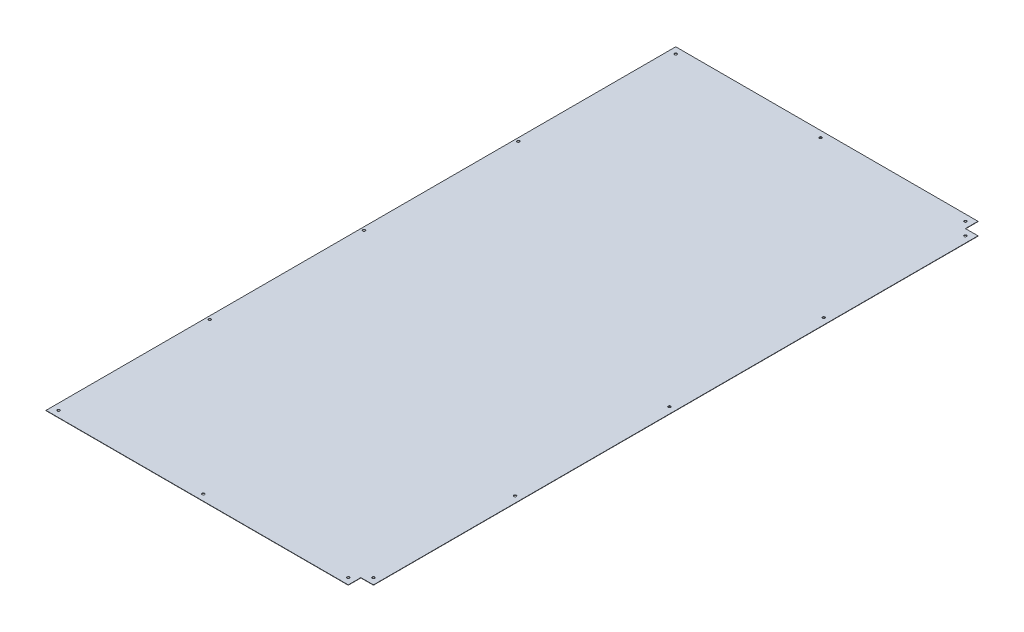
ISO-10303-21;
HEADER;
FILE_DESCRIPTION(('STEP AP214'),'2;1');
FILE_NAME('part.step','',(''),(''),'','','');
FILE_SCHEMA(('AUTOMOTIVE_DESIGN { 1 0 10303 214 1 1 1 1 }'));
ENDSEC;
DATA;
#1=APPLICATION_CONTEXT('core data for automotive mechanical design processes');
#2=APPLICATION_PROTOCOL_DEFINITION('international standard','automotive_design',2000,#1);
#3=PRODUCT_CONTEXT('',#1,'mechanical');
#4=PRODUCT('Part','Part','',(#3));
#5=PRODUCT_RELATED_PRODUCT_CATEGORY('part','',(#4));
#6=PRODUCT_DEFINITION_FORMATION('','',#4);
#7=PRODUCT_DEFINITION_CONTEXT('part definition',#1,'design');
#8=PRODUCT_DEFINITION('design','',#6,#7);
#9=PRODUCT_DEFINITION_SHAPE('','',#8);
#10=(LENGTH_UNIT() NAMED_UNIT(*) SI_UNIT(.MILLI.,.METRE.));
#11=(NAMED_UNIT(*) PLANE_ANGLE_UNIT() SI_UNIT($,.RADIAN.));
#12=(NAMED_UNIT(*) SI_UNIT($,.STERADIAN.) SOLID_ANGLE_UNIT());
#13=UNCERTAINTY_MEASURE_WITH_UNIT(LENGTH_MEASURE(1.E-05),#10,'distance_accuracy_value','');
#14=(GEOMETRIC_REPRESENTATION_CONTEXT(3) GLOBAL_UNCERTAINTY_ASSIGNED_CONTEXT((#13)) GLOBAL_UNIT_ASSIGNED_CONTEXT((#10,
#11,#12)) REPRESENTATION_CONTEXT('',''));
#15=CARTESIAN_POINT('',(0.,0.,0.));
#16=DIRECTION('',(0.,0.,1.));
#17=DIRECTION('',(1.,0.,0.));
#18=AXIS2_PLACEMENT_3D('',#15,#16,#17);
#19=CARTESIAN_POINT('',(2.66453525910037E-12,1.,960.000000000001));
#20=DIRECTION('',(0.,0.,1.));
#21=DIRECTION('',(1.,0.,0.));
#22=AXIS2_PLACEMENT_3D('',#19,#20,#21);
#23=PLANE('',#22);
#24=DIRECTION('',(-1.,0.,0.));
#25=VECTOR('',#24,1.);
#26=CARTESIAN_POINT('',(2.66453525910037E-12,0.,960.000000000001));
#27=LINE('',#26,#25);
#28=CARTESIAN_POINT('',(500.,0.,960.));
#29=VERTEX_POINT('',#28);
#30=CARTESIAN_POINT('',(460.,0.,960.));
#31=VERTEX_POINT('',#30);
#32=EDGE_CURVE('E239',#29,#31,#27,.T.);
#33=ORIENTED_EDGE('',*,*,#32,.F.);
#34=DIRECTION('',(0.,-1.,0.));
#35=VECTOR('',#34,1.);
#36=CARTESIAN_POINT('',(500.,1.,960.));
#37=LINE('',#36,#35);
#38=CARTESIAN_POINT('',(500.,1.,960.));
#39=VERTEX_POINT('',#38);
#40=EDGE_CURVE('E98',#39,#29,#37,.T.);
#41=ORIENTED_EDGE('',*,*,#40,.F.);
#42=DIRECTION('',(-1.,0.,0.));
#43=VECTOR('',#42,1.);
#44=CARTESIAN_POINT('',(2.66453525910037E-12,1.,960.000000000001));
#45=LINE('',#44,#43);
#46=CARTESIAN_POINT('',(460.,1.,960.));
#47=VERTEX_POINT('',#46);
#48=EDGE_CURVE('E268',#39,#47,#45,.T.);
#49=ORIENTED_EDGE('',*,*,#48,.T.);
#50=DIRECTION('',(0.,-1.,0.));
#51=VECTOR('',#50,1.);
#52=CARTESIAN_POINT('',(460.,1.,960.));
#53=LINE('',#52,#51);
#54=EDGE_CURVE('E94',#47,#31,#53,.T.);
#55=ORIENTED_EDGE('',*,*,#54,.T.);
#56=EDGE_LOOP('',(#33,#41,#49,#55));
#57=FACE_BOUND('',#56,.T.);
#58=ADVANCED_FACE('F41',(#57),#23,.T.);
#59=CARTESIAN_POINT('',(500.,1.,0.));
#60=DIRECTION('',(-1.,0.,0.));
#61=DIRECTION('',(0.,0.,1.));
#62=AXIS2_PLACEMENT_3D('',#59,#60,#61);
#63=PLANE('',#62);
#64=DIRECTION('',(0.,0.,-1.));
#65=VECTOR('',#64,1.);
#66=CARTESIAN_POINT('',(500.,0.,0.));
#67=LINE('',#66,#65);
#68=CARTESIAN_POINT('',(500.,0.,-960.));
#69=VERTEX_POINT('',#68);
#70=EDGE_CURVE('E242',#29,#69,#67,.T.);
#71=ORIENTED_EDGE('',*,*,#70,.T.);
#72=DIRECTION('',(0.,-1.,0.));
#73=VECTOR('',#72,1.);
#74=CARTESIAN_POINT('',(500.,1.,-960.));
#75=LINE('',#74,#73);
#76=CARTESIAN_POINT('',(500.,1.,-960.));
#77=VERTEX_POINT('',#76);
#78=EDGE_CURVE('E153',#77,#69,#75,.T.);
#79=ORIENTED_EDGE('',*,*,#78,.F.);
#80=DIRECTION('',(0.,0.,-1.));
#81=VECTOR('',#80,1.);
#82=CARTESIAN_POINT('',(500.,1.,0.));
#83=LINE('',#82,#81);
#84=EDGE_CURVE('E436',#39,#77,#83,.T.);
#85=ORIENTED_EDGE('',*,*,#84,.F.);
#86=ORIENTED_EDGE('',*,*,#40,.T.);
#87=EDGE_LOOP('',(#71,#79,#85,#86));
#88=FACE_BOUND('',#87,.T.);
#89=ADVANCED_FACE('F329',(#88),#63,.F.);
#90=CARTESIAN_POINT('',(-2.66453525910039E-12,1.,-959.999999999998));
#91=DIRECTION('',(0.,0.,1.));
#92=DIRECTION('',(1.,0.,0.));
#93=AXIS2_PLACEMENT_3D('',#90,#91,#92);
#94=PLANE('',#93);
#95=DIRECTION('',(-1.,0.,0.));
#96=VECTOR('',#95,1.);
#97=CARTESIAN_POINT('',(-2.66453525910039E-12,0.,-959.999999999998));
#98=LINE('',#97,#96);
#99=CARTESIAN_POINT('',(460.,0.,-960.));
#100=VERTEX_POINT('',#99);
#101=EDGE_CURVE('E246',#69,#100,#98,.T.);
#102=ORIENTED_EDGE('',*,*,#101,.T.);
#103=DIRECTION('',(0.,-1.,0.));
#104=VECTOR('',#103,1.);
#105=CARTESIAN_POINT('',(460.,1.,-960.));
#106=LINE('',#105,#104);
#107=CARTESIAN_POINT('',(460.,1.,-960.));
#108=VERTEX_POINT('',#107);
#109=EDGE_CURVE('E150',#108,#100,#106,.T.);
#110=ORIENTED_EDGE('',*,*,#109,.F.);
#111=DIRECTION('',(-1.,0.,0.));
#112=VECTOR('',#111,1.);
#113=CARTESIAN_POINT('',(-2.66453525910039E-12,1.,-959.999999999998));
#114=LINE('',#113,#112);
#115=EDGE_CURVE('E438',#77,#108,#114,.T.);
#116=ORIENTED_EDGE('',*,*,#115,.F.);
#117=ORIENTED_EDGE('',*,*,#78,.T.);
#118=EDGE_LOOP('',(#102,#110,#116,#117));
#119=FACE_BOUND('',#118,.T.);
#120=ADVANCED_FACE('F334',(#119),#94,.F.);
#121=CARTESIAN_POINT('',(460.,1.,0.));
#122=DIRECTION('',(1.,0.,0.));
#123=DIRECTION('',(0.,0.,-1.));
#124=AXIS2_PLACEMENT_3D('',#121,#122,#123);
#125=PLANE('',#124);
#126=DIRECTION('',(0.,0.,1.));
#127=VECTOR('',#126,1.);
#128=CARTESIAN_POINT('',(460.,0.,0.));
#129=LINE('',#128,#127);
#130=CARTESIAN_POINT('',(460.,0.,-1000.));
#131=VERTEX_POINT('',#130);
#132=EDGE_CURVE('E250',#131,#100,#129,.T.);
#133=ORIENTED_EDGE('',*,*,#132,.F.);
#134=DIRECTION('',(0.,-1.,0.));
#135=VECTOR('',#134,1.);
#136=CARTESIAN_POINT('',(460.,1.,-1000.));
#137=LINE('',#136,#135);
#138=CARTESIAN_POINT('',(460.,1.,-1000.));
#139=VERTEX_POINT('',#138);
#140=EDGE_CURVE('E143',#139,#131,#137,.T.);
#141=ORIENTED_EDGE('',*,*,#140,.F.);
#142=DIRECTION('',(0.,0.,1.));
#143=VECTOR('',#142,1.);
#144=CARTESIAN_POINT('',(460.,1.,0.));
#145=LINE('',#144,#143);
#146=EDGE_CURVE('E445',#139,#108,#145,.T.);
#147=ORIENTED_EDGE('',*,*,#146,.T.);
#148=ORIENTED_EDGE('',*,*,#109,.T.);
#149=EDGE_LOOP('',(#133,#141,#147,#148));
#150=FACE_BOUND('',#149,.T.);
#151=ADVANCED_FACE('F455',(#150),#125,.T.);
#152=CARTESIAN_POINT('',(0.,1.,-1000.));
#153=DIRECTION('',(0.,0.,-1.));
#154=DIRECTION('',(-1.,0.,0.));
#155=AXIS2_PLACEMENT_3D('',#152,#153,#154);
#156=PLANE('',#155);
#157=DIRECTION('',(1.,0.,0.));
#158=VECTOR('',#157,1.);
#159=CARTESIAN_POINT('',(0.,0.,-1000.));
#160=LINE('',#159,#158);
#161=CARTESIAN_POINT('',(-500.,0.,-1000.));
#162=VERTEX_POINT('',#161);
#163=EDGE_CURVE('E254',#162,#131,#160,.T.);
#164=ORIENTED_EDGE('',*,*,#163,.F.);
#165=DIRECTION('',(0.,-1.,0.));
#166=VECTOR('',#165,1.);
#167=CARTESIAN_POINT('',(-500.,1.,-1000.));
#168=LINE('',#167,#166);
#169=CARTESIAN_POINT('',(-500.,1.,-1000.));
#170=VERTEX_POINT('',#169);
#171=EDGE_CURVE('E139',#170,#162,#168,.T.);
#172=ORIENTED_EDGE('',*,*,#171,.F.);
#173=DIRECTION('',(1.,0.,0.));
#174=VECTOR('',#173,1.);
#175=CARTESIAN_POINT('',(0.,1.,-1000.));
#176=LINE('',#175,#174);
#177=EDGE_CURVE('E131',#170,#139,#176,.T.);
#178=ORIENTED_EDGE('',*,*,#177,.T.);
#179=ORIENTED_EDGE('',*,*,#140,.T.);
#180=EDGE_LOOP('',(#164,#172,#178,#179));
#181=FACE_BOUND('',#180,.T.);
#182=ADVANCED_FACE('F452',(#181),#156,.T.);
#183=CARTESIAN_POINT('',(-500.,1.,0.));
#184=DIRECTION('',(1.,0.,0.));
#185=DIRECTION('',(0.,0.,-1.));
#186=AXIS2_PLACEMENT_3D('',#183,#184,#185);
#187=PLANE('',#186);
#188=DIRECTION('',(0.,0.,1.));
#189=VECTOR('',#188,1.);
#190=CARTESIAN_POINT('',(-500.,0.,0.));
#191=LINE('',#190,#189);
#192=CARTESIAN_POINT('',(-500.,0.,1000.));
#193=VERTEX_POINT('',#192);
#194=EDGE_CURVE('E137',#162,#193,#191,.T.);
#195=ORIENTED_EDGE('',*,*,#194,.T.);
#196=DIRECTION('',(0.,-1.,0.));
#197=VECTOR('',#196,1.);
#198=CARTESIAN_POINT('',(-500.,1.,1000.));
#199=LINE('',#198,#197);
#200=CARTESIAN_POINT('',(-500.,1.,1000.));
#201=VERTEX_POINT('',#200);
#202=EDGE_CURVE('E120',#201,#193,#199,.T.);
#203=ORIENTED_EDGE('',*,*,#202,.F.);
#204=DIRECTION('',(0.,0.,1.));
#205=VECTOR('',#204,1.);
#206=CARTESIAN_POINT('',(-500.,1.,0.));
#207=LINE('',#206,#205);
#208=EDGE_CURVE('E124',#170,#201,#207,.T.);
#209=ORIENTED_EDGE('',*,*,#208,.F.);
#210=ORIENTED_EDGE('',*,*,#171,.T.);
#211=EDGE_LOOP('',(#195,#203,#209,#210));
#212=FACE_BOUND('',#211,.T.);
#213=ADVANCED_FACE('F135',(#212),#187,.F.);
#214=CARTESIAN_POINT('',(0.,1.,1000.));
#215=DIRECTION('',(0.,0.,-1.));
#216=DIRECTION('',(-1.,0.,0.));
#217=AXIS2_PLACEMENT_3D('',#214,#215,#216);
#218=PLANE('',#217);
#219=DIRECTION('',(1.,0.,0.));
#220=VECTOR('',#219,1.);
#221=CARTESIAN_POINT('',(0.,0.,1000.));
#222=LINE('',#221,#220);
#223=CARTESIAN_POINT('',(460.,0.,1000.));
#224=VERTEX_POINT('',#223);
#225=EDGE_CURVE('E260',#193,#224,#222,.T.);
#226=ORIENTED_EDGE('',*,*,#225,.T.);
#227=DIRECTION('',(0.,-1.,0.));
#228=VECTOR('',#227,1.);
#229=CARTESIAN_POINT('',(460.,1.,1000.));
#230=LINE('',#229,#228);
#231=CARTESIAN_POINT('',(460.,1.,1000.));
#232=VERTEX_POINT('',#231);
#233=EDGE_CURVE('E122',#232,#224,#230,.T.);
#234=ORIENTED_EDGE('',*,*,#233,.F.);
#235=DIRECTION('',(1.,0.,0.));
#236=VECTOR('',#235,1.);
#237=CARTESIAN_POINT('',(0.,1.,1000.));
#238=LINE('',#237,#236);
#239=EDGE_CURVE('E115',#201,#232,#238,.T.);
#240=ORIENTED_EDGE('',*,*,#239,.F.);
#241=ORIENTED_EDGE('',*,*,#202,.T.);
#242=EDGE_LOOP('',(#226,#234,#240,#241));
#243=FACE_BOUND('',#242,.T.);
#244=ADVANCED_FACE('F118',(#243),#218,.F.);
#245=CARTESIAN_POINT('',(460.000000000001,1.,6.3837823915947E-13));
#246=DIRECTION('',(-1.,0.,0.));
#247=DIRECTION('',(0.,0.,1.));
#248=AXIS2_PLACEMENT_3D('',#245,#246,#247);
#249=PLANE('',#248);
#250=DIRECTION('',(0.,0.,-1.));
#251=VECTOR('',#250,1.);
#252=CARTESIAN_POINT('',(460.000000000001,0.,6.3837823915947E-13));
#253=LINE('',#252,#251);
#254=EDGE_CURVE('E87',#224,#31,#253,.T.);
#255=ORIENTED_EDGE('',*,*,#254,.T.);
#256=ORIENTED_EDGE('',*,*,#54,.F.);
#257=DIRECTION('',(0.,0.,-1.));
#258=VECTOR('',#257,1.);
#259=CARTESIAN_POINT('',(460.000000000001,1.,6.3837823915947E-13));
#260=LINE('',#259,#258);
#261=EDGE_CURVE('E59',#232,#47,#260,.T.);
#262=ORIENTED_EDGE('',*,*,#261,.F.);
#263=ORIENTED_EDGE('',*,*,#233,.T.);
#264=EDGE_LOOP('',(#255,#256,#262,#263));
#265=FACE_BOUND('',#264,.T.);
#266=ADVANCED_FACE('F410',(#265),#249,.F.);
#267=CARTESIAN_POINT('',(0.,1.,0.));
#268=DIRECTION('',(0.,1.,0.));
#269=DIRECTION('',(0.,0.,1.));
#270=AXIS2_PLACEMENT_3D('',#267,#268,#269);
#271=PLANE('',#270);
#272=CARTESIAN_POINT('',(-480.,1.,980.));
#273=DIRECTION('',(0.,1.,0.));
#274=DIRECTION('',(0.,0.,1.));
#275=AXIS2_PLACEMENT_3D('',#272,#273,#274);
#276=CIRCLE('',#275,4.00000000000023);
#277=CARTESIAN_POINT('',(-480.,1.,984.));
#278=VERTEX_POINT('',#277);
#279=EDGE_CURVE('E11',#278,#278,#276,.F.);
#280=ORIENTED_EDGE('',*,*,#279,.T.);
#281=EDGE_LOOP('',(#280));
#282=FACE_BOUND('',#281,.T.);
#283=CARTESIAN_POINT('',(480.,1.,940.));
#284=DIRECTION('',(0.,1.,0.));
#285=DIRECTION('',(0.,0.,1.));
#286=AXIS2_PLACEMENT_3D('',#283,#284,#285);
#287=CIRCLE('',#286,4.00000000000023);
#288=CARTESIAN_POINT('',(480.,1.,944.));
#289=VERTEX_POINT('',#288);
#290=EDGE_CURVE('E51',#289,#289,#287,.F.);
#291=ORIENTED_EDGE('',*,*,#290,.T.);
#292=EDGE_LOOP('',(#291));
#293=FACE_BOUND('',#292,.T.);
#294=CARTESIAN_POINT('',(440.,1.,980.));
#295=DIRECTION('',(0.,1.,0.));
#296=DIRECTION('',(0.,0.,1.));
#297=AXIS2_PLACEMENT_3D('',#294,#295,#296);
#298=CIRCLE('',#297,4.00000000000023);
#299=CARTESIAN_POINT('',(440.,1.,984.));
#300=VERTEX_POINT('',#299);
#301=EDGE_CURVE('E203',#300,#300,#298,.F.);
#302=ORIENTED_EDGE('',*,*,#301,.T.);
#303=EDGE_LOOP('',(#302));
#304=FACE_BOUND('',#303,.T.);
#305=CARTESIAN_POINT('',(-20.0000000000002,1.,980.));
#306=DIRECTION('',(0.,1.,0.));
#307=DIRECTION('',(0.,0.,1.));
#308=AXIS2_PLACEMENT_3D('',#305,#306,#307);
#309=CIRCLE('',#308,4.00000000000023);
#310=CARTESIAN_POINT('',(-20.0000000000002,1.,984.));
#311=VERTEX_POINT('',#310);
#312=EDGE_CURVE('E199',#311,#311,#309,.F.);
#313=ORIENTED_EDGE('',*,*,#312,.T.);
#314=EDGE_LOOP('',(#313));
#315=FACE_BOUND('',#314,.T.);
#316=CARTESIAN_POINT('',(-490.,1.,490.));
#317=DIRECTION('',(0.,1.,0.));
#318=DIRECTION('',(0.,0.,1.));
#319=AXIS2_PLACEMENT_3D('',#316,#317,#318);
#320=CIRCLE('',#319,4.00000000000089);
#321=CARTESIAN_POINT('',(-490.,1.,494.000000000001));
#322=VERTEX_POINT('',#321);
#323=EDGE_CURVE('E195',#322,#322,#320,.F.);
#324=ORIENTED_EDGE('',*,*,#323,.T.);
#325=EDGE_LOOP('',(#324));
#326=FACE_BOUND('',#325,.T.);
#327=CARTESIAN_POINT('',(-490.,1.,0.));
#328=DIRECTION('',(0.,1.,0.));
#329=DIRECTION('',(0.,0.,1.));
#330=AXIS2_PLACEMENT_3D('',#327,#328,#329);
#331=CIRCLE('',#330,4.00000000000023);
#332=CARTESIAN_POINT('',(-490.,1.,4.00000000000022));
#333=VERTEX_POINT('',#332);
#334=EDGE_CURVE('E191',#333,#333,#331,.F.);
#335=ORIENTED_EDGE('',*,*,#334,.T.);
#336=EDGE_LOOP('',(#335));
#337=FACE_BOUND('',#336,.T.);
#338=CARTESIAN_POINT('',(-490.000000000002,1.,-490.));
#339=DIRECTION('',(0.,1.,0.));
#340=DIRECTION('',(0.,0.,1.));
#341=AXIS2_PLACEMENT_3D('',#338,#339,#340);
#342=CIRCLE('',#341,4.00000000000023);
#343=CARTESIAN_POINT('',(-490.000000000002,1.,-486.));
#344=VERTEX_POINT('',#343);
#345=EDGE_CURVE('E187',#344,#344,#342,.F.);
#346=ORIENTED_EDGE('',*,*,#345,.T.);
#347=EDGE_LOOP('',(#346));
#348=FACE_BOUND('',#347,.T.);
#349=CARTESIAN_POINT('',(-480.,1.,-980.));
#350=DIRECTION('',(0.,1.,0.));
#351=DIRECTION('',(0.,0.,1.));
#352=AXIS2_PLACEMENT_3D('',#349,#350,#351);
#353=CIRCLE('',#352,4.00000000000023);
#354=CARTESIAN_POINT('',(-480.,1.,-976.));
#355=VERTEX_POINT('',#354);
#356=EDGE_CURVE('E183',#355,#355,#353,.F.);
#357=ORIENTED_EDGE('',*,*,#356,.T.);
#358=EDGE_LOOP('',(#357));
#359=FACE_BOUND('',#358,.T.);
#360=CARTESIAN_POINT('',(-20.0000000000002,1.,-980.));
#361=DIRECTION('',(0.,1.,0.));
#362=DIRECTION('',(0.,0.,1.));
#363=AXIS2_PLACEMENT_3D('',#360,#361,#362);
#364=CIRCLE('',#363,4.00000000000023);
#365=CARTESIAN_POINT('',(-20.0000000000002,1.,-976.));
#366=VERTEX_POINT('',#365);
#367=EDGE_CURVE('E179',#366,#366,#364,.F.);
#368=ORIENTED_EDGE('',*,*,#367,.T.);
#369=EDGE_LOOP('',(#368));
#370=FACE_BOUND('',#369,.T.);
#371=CARTESIAN_POINT('',(440.,1.,-980.));
#372=DIRECTION('',(0.,1.,0.));
#373=DIRECTION('',(0.,0.,1.));
#374=AXIS2_PLACEMENT_3D('',#371,#372,#373);
#375=CIRCLE('',#374,4.00000000000023);
#376=CARTESIAN_POINT('',(440.,1.,-976.));
#377=VERTEX_POINT('',#376);
#378=EDGE_CURVE('E175',#377,#377,#375,.F.);
#379=ORIENTED_EDGE('',*,*,#378,.T.);
#380=EDGE_LOOP('',(#379));
#381=FACE_BOUND('',#380,.T.);
#382=CARTESIAN_POINT('',(480.,1.,-940.));
#383=DIRECTION('',(0.,1.,0.));
#384=DIRECTION('',(0.,0.,1.));
#385=AXIS2_PLACEMENT_3D('',#382,#383,#384);
#386=CIRCLE('',#385,4.00000000000023);
#387=CARTESIAN_POINT('',(480.,1.,-936.));
#388=VERTEX_POINT('',#387);
#389=EDGE_CURVE('E171',#388,#388,#386,.F.);
#390=ORIENTED_EDGE('',*,*,#389,.T.);
#391=EDGE_LOOP('',(#390));
#392=FACE_BOUND('',#391,.T.);
#393=CARTESIAN_POINT('',(480.,1.,-490.));
#394=DIRECTION('',(0.,1.,0.));
#395=DIRECTION('',(0.,0.,1.));
#396=AXIS2_PLACEMENT_3D('',#393,#394,#395);
#397=CIRCLE('',#396,4.00000000000023);
#398=CARTESIAN_POINT('',(480.,1.,-486.));
#399=VERTEX_POINT('',#398);
#400=EDGE_CURVE('E167',#399,#399,#397,.F.);
#401=ORIENTED_EDGE('',*,*,#400,.T.);
#402=EDGE_LOOP('',(#401));
#403=FACE_BOUND('',#402,.T.);
#404=CARTESIAN_POINT('',(480.,1.,-1.11022302462516E-13));
#405=DIRECTION('',(0.,1.,0.));
#406=DIRECTION('',(0.,0.,1.));
#407=AXIS2_PLACEMENT_3D('',#404,#405,#406);
#408=CIRCLE('',#407,4.00000000000023);
#409=CARTESIAN_POINT('',(480.,1.,4.00000000000011));
#410=VERTEX_POINT('',#409);
#411=EDGE_CURVE('E163',#410,#410,#408,.F.);
#412=ORIENTED_EDGE('',*,*,#411,.T.);
#413=EDGE_LOOP('',(#412));
#414=FACE_BOUND('',#413,.T.);
#415=CARTESIAN_POINT('',(480.,1.,490.));
#416=DIRECTION('',(0.,1.,0.));
#417=DIRECTION('',(0.,0.,1.));
#418=AXIS2_PLACEMENT_3D('',#415,#416,#417);
#419=CIRCLE('',#418,4.00000000000089);
#420=CARTESIAN_POINT('',(480.,1.,494.000000000001));
#421=VERTEX_POINT('',#420);
#422=EDGE_CURVE('E159',#421,#421,#419,.F.);
#423=ORIENTED_EDGE('',*,*,#422,.T.);
#424=EDGE_LOOP('',(#423));
#425=FACE_BOUND('',#424,.T.);
#426=ORIENTED_EDGE('',*,*,#48,.F.);
#427=ORIENTED_EDGE('',*,*,#84,.T.);
#428=ORIENTED_EDGE('',*,*,#115,.T.);
#429=ORIENTED_EDGE('',*,*,#146,.F.);
#430=ORIENTED_EDGE('',*,*,#177,.F.);
#431=ORIENTED_EDGE('',*,*,#208,.T.);
#432=ORIENTED_EDGE('',*,*,#239,.T.);
#433=ORIENTED_EDGE('',*,*,#261,.T.);
#434=EDGE_LOOP('',(#426,#427,#428,#429,#430,#431,#432,#433));
#435=FACE_BOUND('',#434,.T.);
#436=ADVANCED_FACE('F128',(#282,#293,#304,#315,#326,#337,#348,#359,#370,#381,#392,#403,#414,
#425,#435),#271,.T.);
#437=CARTESIAN_POINT('',(0.,0.,0.));
#438=DIRECTION('',(0.,1.,0.));
#439=DIRECTION('',(0.,0.,1.));
#440=AXIS2_PLACEMENT_3D('',#437,#438,#439);
#441=PLANE('',#440);
#442=CARTESIAN_POINT('',(480.,0.,-1.11022302462516E-13));
#443=DIRECTION('',(0.,1.,0.));
#444=DIRECTION('',(0.,0.,1.));
#445=AXIS2_PLACEMENT_3D('',#442,#443,#444);
#446=CIRCLE('',#445,2.99999999999999);
#447=CARTESIAN_POINT('',(480.,0.,2.99999999999988));
#448=VERTEX_POINT('',#447);
#449=EDGE_CURVE('E273',#448,#448,#446,.T.);
#450=ORIENTED_EDGE('',*,*,#449,.T.);
#451=EDGE_LOOP('',(#450));
#452=FACE_BOUND('',#451,.T.);
#453=CARTESIAN_POINT('',(-490.,0.,490.));
#454=DIRECTION('',(0.,1.,0.));
#455=DIRECTION('',(0.,0.,1.));
#456=AXIS2_PLACEMENT_3D('',#453,#454,#455);
#457=CIRCLE('',#456,2.99999999999999);
#458=CARTESIAN_POINT('',(-490.,0.,493.));
#459=VERTEX_POINT('',#458);
#460=EDGE_CURVE('E277',#459,#459,#457,.F.);
#461=ORIENTED_EDGE('',*,*,#460,.F.);
#462=EDGE_LOOP('',(#461));
#463=FACE_BOUND('',#462,.T.);
#464=CARTESIAN_POINT('',(-490.000000000002,0.,-490.));
#465=DIRECTION('',(0.,1.,0.));
#466=DIRECTION('',(0.,0.,1.));
#467=AXIS2_PLACEMENT_3D('',#464,#465,#466);
#468=CIRCLE('',#467,2.99999999999999);
#469=CARTESIAN_POINT('',(-490.000000000002,0.,-487.));
#470=VERTEX_POINT('',#469);
#471=EDGE_CURVE('E281',#470,#470,#468,.T.);
#472=ORIENTED_EDGE('',*,*,#471,.T.);
#473=EDGE_LOOP('',(#472));
#474=FACE_BOUND('',#473,.T.);
#475=CARTESIAN_POINT('',(-480.,0.,-980.));
#476=DIRECTION('',(0.,1.,0.));
#477=DIRECTION('',(0.,0.,1.));
#478=AXIS2_PLACEMENT_3D('',#475,#476,#477);
#479=CIRCLE('',#478,2.99999999999999);
#480=CARTESIAN_POINT('',(-480.,0.,-977.));
#481=VERTEX_POINT('',#480);
#482=EDGE_CURVE('E285',#481,#481,#479,.T.);
#483=ORIENTED_EDGE('',*,*,#482,.T.);
#484=EDGE_LOOP('',(#483));
#485=FACE_BOUND('',#484,.T.);
#486=CARTESIAN_POINT('',(-480.,0.,980.));
#487=DIRECTION('',(0.,1.,0.));
#488=DIRECTION('',(0.,0.,1.));
#489=AXIS2_PLACEMENT_3D('',#486,#487,#488);
#490=CIRCLE('',#489,2.99999999999999);
#491=CARTESIAN_POINT('',(-480.,0.,983.));
#492=VERTEX_POINT('',#491);
#493=EDGE_CURVE('E289',#492,#492,#490,.T.);
#494=ORIENTED_EDGE('',*,*,#493,.T.);
#495=EDGE_LOOP('',(#494));
#496=FACE_BOUND('',#495,.T.);
#497=CARTESIAN_POINT('',(480.,0.,-490.));
#498=DIRECTION('',(0.,1.,0.));
#499=DIRECTION('',(0.,0.,1.));
#500=AXIS2_PLACEMENT_3D('',#497,#498,#499);
#501=CIRCLE('',#500,2.99999999999999);
#502=CARTESIAN_POINT('',(480.,0.,-487.));
#503=VERTEX_POINT('',#502);
#504=EDGE_CURVE('E293',#503,#503,#501,.T.);
#505=ORIENTED_EDGE('',*,*,#504,.T.);
#506=EDGE_LOOP('',(#505));
#507=FACE_BOUND('',#506,.T.);
#508=CARTESIAN_POINT('',(-20.0000000000002,0.,980.));
#509=DIRECTION('',(0.,1.,0.));
#510=DIRECTION('',(0.,0.,1.));
#511=AXIS2_PLACEMENT_3D('',#508,#509,#510);
#512=CIRCLE('',#511,3.);
#513=CARTESIAN_POINT('',(-20.0000000000002,0.,983.));
#514=VERTEX_POINT('',#513);
#515=EDGE_CURVE('E297',#514,#514,#512,.T.);
#516=ORIENTED_EDGE('',*,*,#515,.T.);
#517=EDGE_LOOP('',(#516));
#518=FACE_BOUND('',#517,.T.);
#519=CARTESIAN_POINT('',(-20.0000000000002,0.,-980.));
#520=DIRECTION('',(0.,1.,0.));
#521=DIRECTION('',(0.,0.,1.));
#522=AXIS2_PLACEMENT_3D('',#519,#520,#521);
#523=CIRCLE('',#522,3.);
#524=CARTESIAN_POINT('',(-20.0000000000002,0.,-977.));
#525=VERTEX_POINT('',#524);
#526=EDGE_CURVE('E301',#525,#525,#523,.T.);
#527=ORIENTED_EDGE('',*,*,#526,.T.);
#528=EDGE_LOOP('',(#527));
#529=FACE_BOUND('',#528,.T.);
#530=CARTESIAN_POINT('',(-490.,0.,0.));
#531=DIRECTION('',(0.,1.,0.));
#532=DIRECTION('',(0.,0.,1.));
#533=AXIS2_PLACEMENT_3D('',#530,#531,#532);
#534=CIRCLE('',#533,2.99999999999999);
#535=CARTESIAN_POINT('',(-490.,0.,2.99999999999999));
#536=VERTEX_POINT('',#535);
#537=EDGE_CURVE('E232',#536,#536,#534,.T.);
#538=ORIENTED_EDGE('',*,*,#537,.T.);
#539=EDGE_LOOP('',(#538));
#540=FACE_BOUND('',#539,.T.);
#541=CARTESIAN_POINT('',(440.,0.,980.));
#542=DIRECTION('',(0.,1.,0.));
#543=DIRECTION('',(0.,0.,1.));
#544=AXIS2_PLACEMENT_3D('',#541,#542,#543);
#545=CIRCLE('',#544,2.99999999999999);
#546=CARTESIAN_POINT('',(440.,0.,983.));
#547=VERTEX_POINT('',#546);
#548=EDGE_CURVE('E224',#547,#547,#545,.T.);
#549=ORIENTED_EDGE('',*,*,#548,.T.);
#550=EDGE_LOOP('',(#549));
#551=FACE_BOUND('',#550,.T.);
#552=CARTESIAN_POINT('',(480.,0.,940.));
#553=DIRECTION('',(0.,1.,0.));
#554=DIRECTION('',(0.,0.,1.));
#555=AXIS2_PLACEMENT_3D('',#552,#553,#554);
#556=CIRCLE('',#555,2.99999999999999);
#557=CARTESIAN_POINT('',(480.,0.,943.));
#558=VERTEX_POINT('',#557);
#559=EDGE_CURVE('E220',#558,#558,#556,.T.);
#560=ORIENTED_EDGE('',*,*,#559,.T.);
#561=EDGE_LOOP('',(#560));
#562=FACE_BOUND('',#561,.T.);
#563=CARTESIAN_POINT('',(440.,0.,-980.));
#564=DIRECTION('',(0.,1.,0.));
#565=DIRECTION('',(0.,0.,1.));
#566=AXIS2_PLACEMENT_3D('',#563,#564,#565);
#567=CIRCLE('',#566,2.99999999999999);
#568=CARTESIAN_POINT('',(440.,0.,-977.));
#569=VERTEX_POINT('',#568);
#570=EDGE_CURVE('E223',#569,#569,#567,.T.);
#571=ORIENTED_EDGE('',*,*,#570,.T.);
#572=EDGE_LOOP('',(#571));
#573=FACE_BOUND('',#572,.T.);
#574=CARTESIAN_POINT('',(480.,0.,-940.));
#575=DIRECTION('',(0.,1.,0.));
#576=DIRECTION('',(0.,0.,1.));
#577=AXIS2_PLACEMENT_3D('',#574,#575,#576);
#578=CIRCLE('',#577,2.99999999999999);
#579=CARTESIAN_POINT('',(480.,0.,-937.));
#580=VERTEX_POINT('',#579);
#581=EDGE_CURVE('E229',#580,#580,#578,.T.);
#582=ORIENTED_EDGE('',*,*,#581,.T.);
#583=EDGE_LOOP('',(#582));
#584=FACE_BOUND('',#583,.T.);
#585=ORIENTED_EDGE('',*,*,#32,.T.);
#586=ORIENTED_EDGE('',*,*,#254,.F.);
#587=ORIENTED_EDGE('',*,*,#225,.F.);
#588=ORIENTED_EDGE('',*,*,#194,.F.);
#589=ORIENTED_EDGE('',*,*,#163,.T.);
#590=ORIENTED_EDGE('',*,*,#132,.T.);
#591=ORIENTED_EDGE('',*,*,#101,.F.);
#592=ORIENTED_EDGE('',*,*,#70,.F.);
#593=EDGE_LOOP('',(#585,#586,#587,#588,#589,#590,#591,#592));
#594=FACE_BOUND('',#593,.T.);
#595=CARTESIAN_POINT('',(480.,0.,490.));
#596=DIRECTION('',(0.,1.,0.));
#597=DIRECTION('',(0.,0.,1.));
#598=AXIS2_PLACEMENT_3D('',#595,#596,#597);
#599=CIRCLE('',#598,2.99999999999999);
#600=CARTESIAN_POINT('',(480.,0.,493.));
#601=VERTEX_POINT('',#600);
#602=EDGE_CURVE('E265',#601,#601,#599,.F.);
#603=ORIENTED_EDGE('',*,*,#602,.F.);
#604=EDGE_LOOP('',(#603));
#605=FACE_BOUND('',#604,.T.);
#606=ADVANCED_FACE('F308',(#452,#463,#474,#485,#496,#507,#518,#529,#540,#551,#562,#573,#584,
#594,#605),#441,.F.);
#607=CARTESIAN_POINT('',(-480.,0.,980.));
#608=DIRECTION('',(0.,1.,0.));
#609=DIRECTION('',(0.,0.,1.));
#610=AXIS2_PLACEMENT_3D('',#607,#608,#609);
#611=CONICAL_SURFACE('',#610,2.99999999999999,0.785398163397554);
#612=ORIENTED_EDGE('',*,*,#279,.F.);
#613=EDGE_LOOP('',(#612));
#614=FACE_BOUND('',#613,.T.);
#615=ORIENTED_EDGE('',*,*,#493,.F.);
#616=EDGE_LOOP('',(#615));
#617=FACE_BOUND('',#616,.T.);
#618=ADVANCED_FACE('F216',(#614,#617),#611,.F.);
#619=CARTESIAN_POINT('',(480.,0.,940.));
#620=DIRECTION('',(0.,1.,0.));
#621=DIRECTION('',(0.,0.,1.));
#622=AXIS2_PLACEMENT_3D('',#619,#620,#621);
#623=CONICAL_SURFACE('',#622,2.99999999999999,0.785398163397554);
#624=ORIENTED_EDGE('',*,*,#290,.F.);
#625=EDGE_LOOP('',(#624));
#626=FACE_BOUND('',#625,.T.);
#627=ORIENTED_EDGE('',*,*,#559,.F.);
#628=EDGE_LOOP('',(#627));
#629=FACE_BOUND('',#628,.T.);
#630=ADVANCED_FACE('F212',(#626,#629),#623,.F.);
#631=CARTESIAN_POINT('',(440.,0.,980.));
#632=DIRECTION('',(0.,1.,0.));
#633=DIRECTION('',(0.,0.,1.));
#634=AXIS2_PLACEMENT_3D('',#631,#632,#633);
#635=CONICAL_SURFACE('',#634,2.99999999999999,0.785398163397554);
#636=ORIENTED_EDGE('',*,*,#301,.F.);
#637=EDGE_LOOP('',(#636));
#638=FACE_BOUND('',#637,.T.);
#639=ORIENTED_EDGE('',*,*,#548,.F.);
#640=EDGE_LOOP('',(#639));
#641=FACE_BOUND('',#640,.T.);
#642=ADVANCED_FACE('F215',(#638,#641),#635,.F.);
#643=CARTESIAN_POINT('',(-20.0000000000002,0.,980.));
#644=DIRECTION('',(0.,1.,0.));
#645=DIRECTION('',(0.,0.,1.));
#646=AXIS2_PLACEMENT_3D('',#643,#644,#645);
#647=CONICAL_SURFACE('',#646,3.,0.785398163397554);
#648=ORIENTED_EDGE('',*,*,#312,.F.);
#649=EDGE_LOOP('',(#648));
#650=FACE_BOUND('',#649,.T.);
#651=ORIENTED_EDGE('',*,*,#515,.F.);
#652=EDGE_LOOP('',(#651));
#653=FACE_BOUND('',#652,.T.);
#654=ADVANCED_FACE('F324',(#650,#653),#647,.F.);
#655=CARTESIAN_POINT('',(-490.,1.,490.));
#656=DIRECTION('',(0.,1.,0.));
#657=DIRECTION('',(0.,0.,1.));
#658=AXIS2_PLACEMENT_3D('',#655,#656,#657);
#659=CONICAL_SURFACE('',#658,4.00000000000089,0.785398163397554);
#660=ORIENTED_EDGE('',*,*,#460,.T.);
#661=EDGE_LOOP('',(#660));
#662=FACE_BOUND('',#661,.T.);
#663=ORIENTED_EDGE('',*,*,#323,.F.);
#664=EDGE_LOOP('',(#663));
#665=FACE_BOUND('',#664,.T.);
#666=ADVANCED_FACE('F314',(#662,#665),#659,.F.);
#667=CARTESIAN_POINT('',(-490.,0.,0.));
#668=DIRECTION('',(0.,1.,0.));
#669=DIRECTION('',(0.,0.,1.));
#670=AXIS2_PLACEMENT_3D('',#667,#668,#669);
#671=CONICAL_SURFACE('',#670,2.99999999999999,0.785398163397554);
#672=ORIENTED_EDGE('',*,*,#334,.F.);
#673=EDGE_LOOP('',(#672));
#674=FACE_BOUND('',#673,.T.);
#675=ORIENTED_EDGE('',*,*,#537,.F.);
#676=EDGE_LOOP('',(#675));
#677=FACE_BOUND('',#676,.T.);
#678=ADVANCED_FACE('F311',(#674,#677),#671,.F.);
#679=CARTESIAN_POINT('',(-490.000000000002,0.,-490.));
#680=DIRECTION('',(0.,1.,0.));
#681=DIRECTION('',(0.,0.,1.));
#682=AXIS2_PLACEMENT_3D('',#679,#680,#681);
#683=CONICAL_SURFACE('',#682,2.99999999999999,0.785398163397554);
#684=ORIENTED_EDGE('',*,*,#345,.F.);
#685=EDGE_LOOP('',(#684));
#686=FACE_BOUND('',#685,.T.);
#687=ORIENTED_EDGE('',*,*,#471,.F.);
#688=EDGE_LOOP('',(#687));
#689=FACE_BOUND('',#688,.T.);
#690=ADVANCED_FACE('F313',(#686,#689),#683,.F.);
#691=CARTESIAN_POINT('',(-480.,0.,-980.));
#692=DIRECTION('',(0.,1.,0.));
#693=DIRECTION('',(0.,0.,1.));
#694=AXIS2_PLACEMENT_3D('',#691,#692,#693);
#695=CONICAL_SURFACE('',#694,2.99999999999999,0.785398163397554);
#696=ORIENTED_EDGE('',*,*,#356,.F.);
#697=EDGE_LOOP('',(#696));
#698=FACE_BOUND('',#697,.T.);
#699=ORIENTED_EDGE('',*,*,#482,.F.);
#700=EDGE_LOOP('',(#699));
#701=FACE_BOUND('',#700,.T.);
#702=ADVANCED_FACE('F321',(#698,#701),#695,.F.);
#703=CARTESIAN_POINT('',(-20.0000000000002,0.,-980.));
#704=DIRECTION('',(0.,1.,0.));
#705=DIRECTION('',(0.,0.,1.));
#706=AXIS2_PLACEMENT_3D('',#703,#704,#705);
#707=CONICAL_SURFACE('',#706,3.,0.785398163397554);
#708=ORIENTED_EDGE('',*,*,#367,.F.);
#709=EDGE_LOOP('',(#708));
#710=FACE_BOUND('',#709,.T.);
#711=ORIENTED_EDGE('',*,*,#526,.F.);
#712=EDGE_LOOP('',(#711));
#713=FACE_BOUND('',#712,.T.);
#714=ADVANCED_FACE('F359',(#710,#713),#707,.F.);
#715=CARTESIAN_POINT('',(440.,0.,-980.));
#716=DIRECTION('',(0.,1.,0.));
#717=DIRECTION('',(0.,0.,1.));
#718=AXIS2_PLACEMENT_3D('',#715,#716,#717);
#719=CONICAL_SURFACE('',#718,2.99999999999999,0.785398163397554);
#720=ORIENTED_EDGE('',*,*,#378,.F.);
#721=EDGE_LOOP('',(#720));
#722=FACE_BOUND('',#721,.T.);
#723=ORIENTED_EDGE('',*,*,#570,.F.);
#724=EDGE_LOOP('',(#723));
#725=FACE_BOUND('',#724,.T.);
#726=ADVANCED_FACE('F361',(#722,#725),#719,.F.);
#727=CARTESIAN_POINT('',(480.,0.,-940.));
#728=DIRECTION('',(0.,1.,0.));
#729=DIRECTION('',(0.,0.,1.));
#730=AXIS2_PLACEMENT_3D('',#727,#728,#729);
#731=CONICAL_SURFACE('',#730,2.99999999999999,0.785398163397554);
#732=ORIENTED_EDGE('',*,*,#389,.F.);
#733=EDGE_LOOP('',(#732));
#734=FACE_BOUND('',#733,.T.);
#735=ORIENTED_EDGE('',*,*,#581,.F.);
#736=EDGE_LOOP('',(#735));
#737=FACE_BOUND('',#736,.T.);
#738=ADVANCED_FACE('F368',(#734,#737),#731,.F.);
#739=CARTESIAN_POINT('',(480.,0.,-490.));
#740=DIRECTION('',(0.,1.,0.));
#741=DIRECTION('',(0.,0.,1.));
#742=AXIS2_PLACEMENT_3D('',#739,#740,#741);
#743=CONICAL_SURFACE('',#742,2.99999999999999,0.785398163397554);
#744=ORIENTED_EDGE('',*,*,#400,.F.);
#745=EDGE_LOOP('',(#744));
#746=FACE_BOUND('',#745,.T.);
#747=ORIENTED_EDGE('',*,*,#504,.F.);
#748=EDGE_LOOP('',(#747));
#749=FACE_BOUND('',#748,.T.);
#750=ADVANCED_FACE('F377',(#746,#749),#743,.F.);
#751=CARTESIAN_POINT('',(480.,0.,-1.11022302462516E-13));
#752=DIRECTION('',(0.,1.,0.));
#753=DIRECTION('',(0.,0.,1.));
#754=AXIS2_PLACEMENT_3D('',#751,#752,#753);
#755=CONICAL_SURFACE('',#754,2.99999999999999,0.785398163397554);
#756=ORIENTED_EDGE('',*,*,#411,.F.);
#757=EDGE_LOOP('',(#756));
#758=FACE_BOUND('',#757,.T.);
#759=ORIENTED_EDGE('',*,*,#449,.F.);
#760=EDGE_LOOP('',(#759));
#761=FACE_BOUND('',#760,.T.);
#762=ADVANCED_FACE('F380',(#758,#761),#755,.F.);
#763=CARTESIAN_POINT('',(480.,1.,490.));
#764=DIRECTION('',(0.,1.,0.));
#765=DIRECTION('',(0.,0.,1.));
#766=AXIS2_PLACEMENT_3D('',#763,#764,#765);
#767=CONICAL_SURFACE('',#766,4.00000000000089,0.785398163397554);
#768=ORIENTED_EDGE('',*,*,#602,.T.);
#769=EDGE_LOOP('',(#768));
#770=FACE_BOUND('',#769,.T.);
#771=ORIENTED_EDGE('',*,*,#422,.F.);
#772=EDGE_LOOP('',(#771));
#773=FACE_BOUND('',#772,.T.);
#774=ADVANCED_FACE('F43',(#770,#773),#767,.F.);
#775=CLOSED_SHELL('',(#58,#89,#120,#151,#182,#213,#244,#266,#436,#606,#618,#630,#642,#654,#666,
#678,#690,#702,#714,#726,#738,#750,#762,#774));
#776=MANIFOLD_SOLID_BREP('B2',#775);
#777=ADVANCED_BREP_SHAPE_REPRESENTATION('',(#18,#776),#14);
#778=SHAPE_DEFINITION_REPRESENTATION(#9,#777);
ENDSEC;
END-ISO-10303-21;
